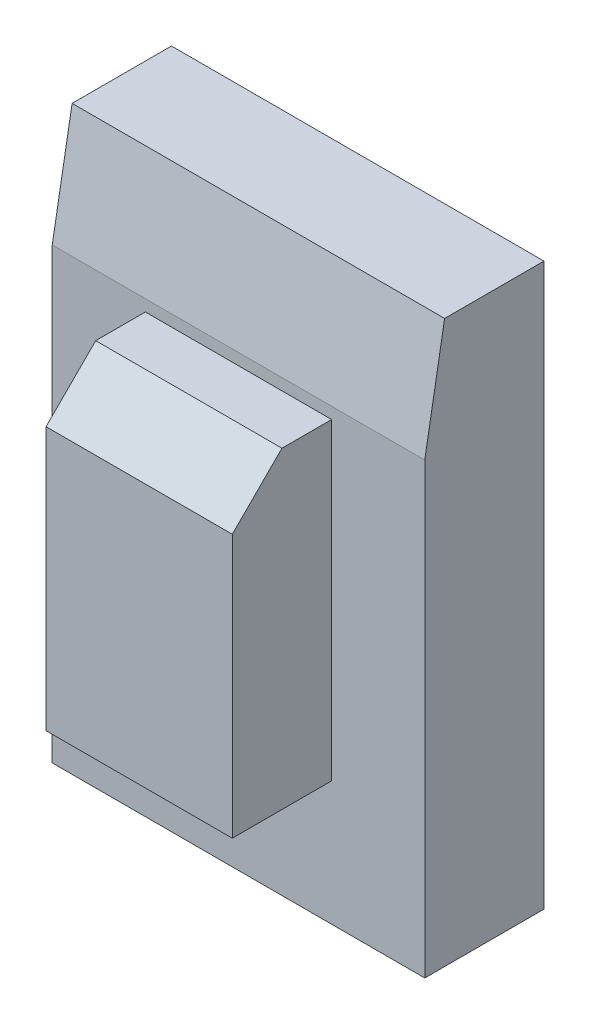
ISO-10303-21;
HEADER;
FILE_DESCRIPTION(('STEP AP214'),'2;1');
FILE_NAME('part.step','',(''),(''),'','','');
FILE_SCHEMA(('AUTOMOTIVE_DESIGN { 1 0 10303 214 1 1 1 1 }'));
ENDSEC;
DATA;
#1=APPLICATION_CONTEXT('core data for automotive mechanical design processes');
#2=APPLICATION_PROTOCOL_DEFINITION('international standard','automotive_design',2000,#1);
#3=PRODUCT_CONTEXT('',#1,'mechanical');
#4=PRODUCT('Part','Part','',(#3));
#5=PRODUCT_RELATED_PRODUCT_CATEGORY('part','',(#4));
#6=PRODUCT_DEFINITION_FORMATION('','',#4);
#7=PRODUCT_DEFINITION_CONTEXT('part definition',#1,'design');
#8=PRODUCT_DEFINITION('design','',#6,#7);
#9=PRODUCT_DEFINITION_SHAPE('','',#8);
#10=(LENGTH_UNIT() NAMED_UNIT(*) SI_UNIT(.MILLI.,.METRE.));
#11=(NAMED_UNIT(*) PLANE_ANGLE_UNIT() SI_UNIT($,.RADIAN.));
#12=(NAMED_UNIT(*) SI_UNIT($,.STERADIAN.) SOLID_ANGLE_UNIT());
#13=UNCERTAINTY_MEASURE_WITH_UNIT(LENGTH_MEASURE(1.E-05),#10,'distance_accuracy_value','');
#14=(GEOMETRIC_REPRESENTATION_CONTEXT(3) GLOBAL_UNCERTAINTY_ASSIGNED_CONTEXT((#13)) GLOBAL_UNIT_ASSIGNED_CONTEXT((#10,
#11,#12)) REPRESENTATION_CONTEXT('',''));
#15=CARTESIAN_POINT('',(0.,0.,0.));
#16=DIRECTION('',(0.,0.,1.));
#17=DIRECTION('',(1.,0.,0.));
#18=AXIS2_PLACEMENT_3D('',#15,#16,#17);
#19=CARTESIAN_POINT('',(0.,0.,3.048));
#20=DIRECTION('',(1.,0.,0.));
#21=DIRECTION('',(0.,0.,-1.));
#22=AXIS2_PLACEMENT_3D('',#19,#20,#21);
#23=PLANE('',#22);
#24=DIRECTION('',(0.,-1.,0.));
#25=VECTOR('',#24,1.);
#26=CARTESIAN_POINT('',(0.,0.,3.048));
#27=LINE('',#26,#25);
#28=CARTESIAN_POINT('',(0.,-2.8810111643658,3.048));
#29=VERTEX_POINT('',#28);
#30=CARTESIAN_POINT('',(0.,-14.351,3.048));
#31=VERTEX_POINT('',#30);
#32=EDGE_CURVE('E157',#29,#31,#27,.T.);
#33=ORIENTED_EDGE('',*,*,#32,.F.);
#34=DIRECTION('',(0.,0.984807753012208,-0.173648177666931));
#35=VECTOR('',#34,1.);
#36=CARTESIAN_POINT('',(0.,-2.8810111643658,3.048));
#37=LINE('',#36,#35);
#38=CARTESIAN_POINT('',(0.,0.,2.54));
#39=VERTEX_POINT('',#38);
#40=EDGE_CURVE('E61',#29,#39,#37,.T.);
#41=ORIENTED_EDGE('',*,*,#40,.T.);
#42=DIRECTION('',(0.,0.,-1.));
#43=VECTOR('',#42,1.);
#44=CARTESIAN_POINT('',(0.,0.,3.048));
#45=LINE('',#44,#43);
#46=CARTESIAN_POINT('',(0.,0.,0.));
#47=VERTEX_POINT('',#46);
#48=EDGE_CURVE('E165',#39,#47,#45,.T.);
#49=ORIENTED_EDGE('',*,*,#48,.T.);
#50=DIRECTION('',(0.,-1.,0.));
#51=VECTOR('',#50,1.);
#52=CARTESIAN_POINT('',(0.,0.,0.));
#53=LINE('',#52,#51);
#54=CARTESIAN_POINT('',(0.,-14.351,0.));
#55=VERTEX_POINT('',#54);
#56=EDGE_CURVE('E156',#47,#55,#53,.T.);
#57=ORIENTED_EDGE('',*,*,#56,.T.);
#58=DIRECTION('',(0.,0.,-1.));
#59=VECTOR('',#58,1.);
#60=CARTESIAN_POINT('',(0.,-14.351,3.048));
#61=LINE('',#60,#59);
#62=EDGE_CURVE('E181',#31,#55,#61,.T.);
#63=ORIENTED_EDGE('',*,*,#62,.F.);
#64=EDGE_LOOP('',(#33,#41,#49,#57,#63));
#65=FACE_BOUND('',#64,.T.);
#66=ADVANCED_FACE('F38',(#65),#23,.F.);
#67=CARTESIAN_POINT('',(0.,-14.351,3.048));
#68=DIRECTION('',(0.,1.,0.));
#69=DIRECTION('',(0.,0.,1.));
#70=AXIS2_PLACEMENT_3D('',#67,#68,#69);
#71=PLANE('',#70);
#72=DIRECTION('',(1.,0.,0.));
#73=VECTOR('',#72,1.);
#74=CARTESIAN_POINT('',(0.,-14.351,0.));
#75=LINE('',#74,#73);
#76=CARTESIAN_POINT('',(9.525,-14.351,0.));
#77=VERTEX_POINT('',#76);
#78=EDGE_CURVE('E168',#55,#77,#75,.T.);
#79=ORIENTED_EDGE('',*,*,#78,.T.);
#80=DIRECTION('',(0.,0.,-1.));
#81=VECTOR('',#80,1.);
#82=CARTESIAN_POINT('',(9.525,-14.351,3.048));
#83=LINE('',#82,#81);
#84=CARTESIAN_POINT('',(9.525,-14.351,3.048));
#85=VERTEX_POINT('',#84);
#86=EDGE_CURVE('E178',#85,#77,#83,.T.);
#87=ORIENTED_EDGE('',*,*,#86,.F.);
#88=DIRECTION('',(1.,0.,0.));
#89=VECTOR('',#88,1.);
#90=CARTESIAN_POINT('',(0.,-14.351,3.048));
#91=LINE('',#90,#89);
#92=EDGE_CURVE('E159',#31,#85,#91,.T.);
#93=ORIENTED_EDGE('',*,*,#92,.F.);
#94=ORIENTED_EDGE('',*,*,#62,.T.);
#95=EDGE_LOOP('',(#79,#87,#93,#94));
#96=FACE_BOUND('',#95,.T.);
#97=ADVANCED_FACE('F204',(#96),#71,.F.);
#98=CARTESIAN_POINT('',(9.525,0.,3.048));
#99=DIRECTION('',(-1.,0.,0.));
#100=DIRECTION('',(0.,-1.,0.));
#101=AXIS2_PLACEMENT_3D('',#98,#99,#100);
#102=PLANE('',#101);
#103=DIRECTION('',(0.,0.,-1.));
#104=VECTOR('',#103,1.);
#105=CARTESIAN_POINT('',(9.525,0.,3.048));
#106=LINE('',#105,#104);
#107=CARTESIAN_POINT('',(9.525,0.,2.54));
#108=VERTEX_POINT('',#107);
#109=CARTESIAN_POINT('',(9.525,0.,0.));
#110=VERTEX_POINT('',#109);
#111=EDGE_CURVE('E176',#108,#110,#106,.T.);
#112=ORIENTED_EDGE('',*,*,#111,.F.);
#113=DIRECTION('',(0.,-0.984807753012208,0.173648177666931));
#114=VECTOR('',#113,1.);
#115=CARTESIAN_POINT('',(9.525,-2.8810111643658,3.048));
#116=LINE('',#115,#114);
#117=CARTESIAN_POINT('',(9.525,-2.8810111643658,3.048));
#118=VERTEX_POINT('',#117);
#119=EDGE_CURVE('E11',#108,#118,#116,.T.);
#120=ORIENTED_EDGE('',*,*,#119,.T.);
#121=DIRECTION('',(0.,1.,0.));
#122=VECTOR('',#121,1.);
#123=CARTESIAN_POINT('',(9.525,0.,3.048));
#124=LINE('',#123,#122);
#125=EDGE_CURVE('E162',#85,#118,#124,.T.);
#126=ORIENTED_EDGE('',*,*,#125,.F.);
#127=ORIENTED_EDGE('',*,*,#86,.T.);
#128=DIRECTION('',(0.,1.,0.));
#129=VECTOR('',#128,1.);
#130=CARTESIAN_POINT('',(9.525,0.,0.));
#131=LINE('',#130,#129);
#132=EDGE_CURVE('E170',#77,#110,#131,.T.);
#133=ORIENTED_EDGE('',*,*,#132,.T.);
#134=EDGE_LOOP('',(#112,#120,#126,#127,#133));
#135=FACE_BOUND('',#134,.T.);
#136=ADVANCED_FACE('F208',(#135),#102,.F.);
#137=CARTESIAN_POINT('',(0.,0.,3.048));
#138=DIRECTION('',(0.,-1.,0.));
#139=DIRECTION('',(0.,0.,-1.));
#140=AXIS2_PLACEMENT_3D('',#137,#138,#139);
#141=PLANE('',#140);
#142=ORIENTED_EDGE('',*,*,#48,.F.);
#143=DIRECTION('',(1.,0.,0.));
#144=VECTOR('',#143,1.);
#145=CARTESIAN_POINT('',(9.525,0.,2.54));
#146=LINE('',#145,#144);
#147=EDGE_CURVE('E47',#39,#108,#146,.T.);
#148=ORIENTED_EDGE('',*,*,#147,.T.);
#149=ORIENTED_EDGE('',*,*,#111,.T.);
#150=DIRECTION('',(-1.,0.,0.));
#151=VECTOR('',#150,1.);
#152=CARTESIAN_POINT('',(0.,0.,0.));
#153=LINE('',#152,#151);
#154=EDGE_CURVE('E160',#110,#47,#153,.T.);
#155=ORIENTED_EDGE('',*,*,#154,.T.);
#156=EDGE_LOOP('',(#142,#148,#149,#155));
#157=FACE_BOUND('',#156,.T.);
#158=ADVANCED_FACE('F229',(#157),#141,.F.);
#159=CARTESIAN_POINT('',(0.,0.,3.048));
#160=DIRECTION('',(0.,0.,1.));
#161=DIRECTION('',(1.,0.,0.));
#162=AXIS2_PLACEMENT_3D('',#159,#160,#161);
#163=PLANE('',#162);
#164=DIRECTION('',(0.,1.,0.));
#165=VECTOR('',#164,1.);
#166=CARTESIAN_POINT('',(7.14375,-11.176,3.048));
#167=LINE('',#166,#165);
#168=CARTESIAN_POINT('',(7.14375,-11.176,3.048));
#169=VERTEX_POINT('',#168);
#170=CARTESIAN_POINT('',(7.14375,-3.175,3.048));
#171=VERTEX_POINT('',#170);
#172=EDGE_CURVE('E144',#169,#171,#167,.T.);
#173=ORIENTED_EDGE('',*,*,#172,.F.);
#174=DIRECTION('',(1.,0.,0.));
#175=VECTOR('',#174,1.);
#176=CARTESIAN_POINT('',(2.38125,-11.176,3.048));
#177=LINE('',#176,#175);
#178=CARTESIAN_POINT('',(2.38125,-11.176,3.048));
#179=VERTEX_POINT('',#178);
#180=EDGE_CURVE('E151',#179,#169,#177,.T.);
#181=ORIENTED_EDGE('',*,*,#180,.F.);
#182=DIRECTION('',(0.,-1.,0.));
#183=VECTOR('',#182,1.);
#184=CARTESIAN_POINT('',(2.38125,-3.175,3.048));
#185=LINE('',#184,#183);
#186=CARTESIAN_POINT('',(2.38125,-3.175,3.048));
#187=VERTEX_POINT('',#186);
#188=EDGE_CURVE('E131',#187,#179,#185,.T.);
#189=ORIENTED_EDGE('',*,*,#188,.F.);
#190=DIRECTION('',(-1.,0.,0.));
#191=VECTOR('',#190,1.);
#192=CARTESIAN_POINT('',(2.38125,-3.175,3.048));
#193=LINE('',#192,#191);
#194=EDGE_CURVE('E147',#171,#187,#193,.T.);
#195=ORIENTED_EDGE('',*,*,#194,.F.);
#196=EDGE_LOOP('',(#173,#181,#189,#195));
#197=FACE_BOUND('',#196,.T.);
#198=ORIENTED_EDGE('',*,*,#125,.T.);
#199=DIRECTION('',(-1.,0.,0.));
#200=VECTOR('',#199,1.);
#201=CARTESIAN_POINT('',(0.,-2.8810111643658,3.048));
#202=LINE('',#201,#200);
#203=EDGE_CURVE('E191',#118,#29,#202,.T.);
#204=ORIENTED_EDGE('',*,*,#203,.T.);
#205=ORIENTED_EDGE('',*,*,#32,.T.);
#206=ORIENTED_EDGE('',*,*,#92,.T.);
#207=EDGE_LOOP('',(#198,#204,#205,#206));
#208=FACE_BOUND('',#207,.T.);
#209=ADVANCED_FACE('F196',(#197,#208),#163,.T.);
#210=CARTESIAN_POINT('',(0.,0.,0.));
#211=DIRECTION('',(0.,0.,1.));
#212=DIRECTION('',(1.,0.,0.));
#213=AXIS2_PLACEMENT_3D('',#210,#211,#212);
#214=PLANE('',#213);
#215=ORIENTED_EDGE('',*,*,#56,.F.);
#216=ORIENTED_EDGE('',*,*,#154,.F.);
#217=ORIENTED_EDGE('',*,*,#132,.F.);
#218=ORIENTED_EDGE('',*,*,#78,.F.);
#219=EDGE_LOOP('',(#215,#216,#217,#218));
#220=FACE_BOUND('',#219,.T.);
#221=ADVANCED_FACE('F232',(#220),#214,.F.);
#222=CARTESIAN_POINT('',(7.14375,-11.176,5.588));
#223=DIRECTION('',(-1.,0.,0.));
#224=DIRECTION('',(0.,0.,1.));
#225=AXIS2_PLACEMENT_3D('',#222,#223,#224);
#226=PLANE('',#225);
#227=DIRECTION('',(0.,0.,-1.));
#228=VECTOR('',#227,1.);
#229=CARTESIAN_POINT('',(7.14375,-3.175,5.588));
#230=LINE('',#229,#228);
#231=CARTESIAN_POINT('',(7.14375,-3.175,4.31799999999999));
#232=VERTEX_POINT('',#231);
#233=EDGE_CURVE('E154',#232,#171,#230,.T.);
#234=ORIENTED_EDGE('',*,*,#233,.F.);
#235=DIRECTION('',(0.,0.707106781186546,-0.707106781186549));
#236=VECTOR('',#235,1.);
#237=CARTESIAN_POINT('',(7.14375,-4.445,5.588));
#238=LINE('',#237,#236);
#239=CARTESIAN_POINT('',(7.14375,-4.445,5.588));
#240=VERTEX_POINT('',#239);
#241=EDGE_CURVE('E189',#232,#240,#238,.F.);
#242=ORIENTED_EDGE('',*,*,#241,.T.);
#243=DIRECTION('',(0.,1.,0.));
#244=VECTOR('',#243,1.);
#245=CARTESIAN_POINT('',(7.14375,-11.176,5.588));
#246=LINE('',#245,#244);
#247=CARTESIAN_POINT('',(7.14375,-11.176,5.588));
#248=VERTEX_POINT('',#247);
#249=EDGE_CURVE('E124',#248,#240,#246,.T.);
#250=ORIENTED_EDGE('',*,*,#249,.F.);
#251=DIRECTION('',(0.,0.,-1.));
#252=VECTOR('',#251,1.);
#253=CARTESIAN_POINT('',(7.14375,-11.176,5.588));
#254=LINE('',#253,#252);
#255=EDGE_CURVE('E135',#248,#169,#254,.T.);
#256=ORIENTED_EDGE('',*,*,#255,.T.);
#257=ORIENTED_EDGE('',*,*,#172,.T.);
#258=EDGE_LOOP('',(#234,#242,#250,#256,#257));
#259=FACE_BOUND('',#258,.T.);
#260=ADVANCED_FACE('F235',(#259),#226,.F.);
#261=CARTESIAN_POINT('',(2.38125,-3.175,5.588));
#262=DIRECTION('',(0.,-1.,0.));
#263=DIRECTION('',(0.,0.,-1.));
#264=AXIS2_PLACEMENT_3D('',#261,#262,#263);
#265=PLANE('',#264);
#266=DIRECTION('',(0.,0.,-1.));
#267=VECTOR('',#266,1.);
#268=CARTESIAN_POINT('',(2.38125,-3.175,5.588));
#269=LINE('',#268,#267);
#270=CARTESIAN_POINT('',(2.38125,-3.175,4.31799999999999));
#271=VERTEX_POINT('',#270);
#272=EDGE_CURVE('E134',#271,#187,#269,.T.);
#273=ORIENTED_EDGE('',*,*,#272,.F.);
#274=DIRECTION('',(1.,0.,0.));
#275=VECTOR('',#274,1.);
#276=CARTESIAN_POINT('',(2.38125,-3.175,4.31799999999999));
#277=LINE('',#276,#275);
#278=EDGE_CURVE('E187',#271,#232,#277,.T.);
#279=ORIENTED_EDGE('',*,*,#278,.T.);
#280=ORIENTED_EDGE('',*,*,#233,.T.);
#281=ORIENTED_EDGE('',*,*,#194,.T.);
#282=EDGE_LOOP('',(#273,#279,#280,#281));
#283=FACE_BOUND('',#282,.T.);
#284=ADVANCED_FACE('F242',(#283),#265,.F.);
#285=CARTESIAN_POINT('',(2.38125,-3.175,5.588));
#286=DIRECTION('',(1.,0.,0.));
#287=DIRECTION('',(0.,1.,0.));
#288=AXIS2_PLACEMENT_3D('',#285,#286,#287);
#289=PLANE('',#288);
#290=DIRECTION('',(0.,-1.,0.));
#291=VECTOR('',#290,1.);
#292=CARTESIAN_POINT('',(2.38125,-3.175,5.588));
#293=LINE('',#292,#291);
#294=CARTESIAN_POINT('',(2.38125,-4.445,5.588));
#295=VERTEX_POINT('',#294);
#296=CARTESIAN_POINT('',(2.38125,-11.176,5.588));
#297=VERTEX_POINT('',#296);
#298=EDGE_CURVE('E114',#295,#297,#293,.T.);
#299=ORIENTED_EDGE('',*,*,#298,.F.);
#300=DIRECTION('',(0.,-0.707106781186546,0.707106781186549));
#301=VECTOR('',#300,1.);
#302=CARTESIAN_POINT('',(2.38125,-4.445,5.588));
#303=LINE('',#302,#301);
#304=EDGE_CURVE('E185',#295,#271,#303,.F.);
#305=ORIENTED_EDGE('',*,*,#304,.T.);
#306=ORIENTED_EDGE('',*,*,#272,.T.);
#307=ORIENTED_EDGE('',*,*,#188,.T.);
#308=DIRECTION('',(0.,0.,-1.));
#309=VECTOR('',#308,1.);
#310=CARTESIAN_POINT('',(2.38125,-11.176,5.588));
#311=LINE('',#310,#309);
#312=EDGE_CURVE('E128',#297,#179,#311,.T.);
#313=ORIENTED_EDGE('',*,*,#312,.F.);
#314=EDGE_LOOP('',(#299,#305,#306,#307,#313));
#315=FACE_BOUND('',#314,.T.);
#316=ADVANCED_FACE('F129',(#315),#289,.F.);
#317=CARTESIAN_POINT('',(2.38125,-11.176,5.588));
#318=DIRECTION('',(0.,1.,0.));
#319=DIRECTION('',(0.,0.,1.));
#320=AXIS2_PLACEMENT_3D('',#317,#318,#319);
#321=PLANE('',#320);
#322=ORIENTED_EDGE('',*,*,#180,.T.);
#323=ORIENTED_EDGE('',*,*,#255,.F.);
#324=DIRECTION('',(1.,0.,0.));
#325=VECTOR('',#324,1.);
#326=CARTESIAN_POINT('',(2.38125,-11.176,5.588));
#327=LINE('',#326,#325);
#328=EDGE_CURVE('E119',#297,#248,#327,.T.);
#329=ORIENTED_EDGE('',*,*,#328,.F.);
#330=ORIENTED_EDGE('',*,*,#312,.T.);
#331=EDGE_LOOP('',(#322,#323,#329,#330));
#332=FACE_BOUND('',#331,.T.);
#333=ADVANCED_FACE('F137',(#332),#321,.F.);
#334=CARTESIAN_POINT('',(0.,0.,5.588));
#335=DIRECTION('',(0.,0.,-1.));
#336=DIRECTION('',(-1.,0.,0.));
#337=AXIS2_PLACEMENT_3D('',#334,#335,#336);
#338=PLANE('',#337);
#339=ORIENTED_EDGE('',*,*,#249,.T.);
#340=DIRECTION('',(-1.,0.,0.));
#341=VECTOR('',#340,1.);
#342=CARTESIAN_POINT('',(0.,-4.445,5.588));
#343=LINE('',#342,#341);
#344=EDGE_CURVE('E122',#240,#295,#343,.T.);
#345=ORIENTED_EDGE('',*,*,#344,.T.);
#346=ORIENTED_EDGE('',*,*,#298,.T.);
#347=ORIENTED_EDGE('',*,*,#328,.T.);
#348=EDGE_LOOP('',(#339,#345,#346,#347));
#349=FACE_BOUND('',#348,.T.);
#350=ADVANCED_FACE('F117',(#349),#338,.F.);
#351=CARTESIAN_POINT('',(0.,-4.445,5.588));
#352=DIRECTION('',(0.,-0.707106781186549,-0.707106781186546));
#353=DIRECTION('',(-1.,0.,0.));
#354=AXIS2_PLACEMENT_3D('',#351,#352,#353);
#355=PLANE('',#354);
#356=ORIENTED_EDGE('',*,*,#241,.F.);
#357=ORIENTED_EDGE('',*,*,#278,.F.);
#358=ORIENTED_EDGE('',*,*,#304,.F.);
#359=ORIENTED_EDGE('',*,*,#344,.F.);
#360=EDGE_LOOP('',(#356,#357,#358,#359));
#361=FACE_BOUND('',#360,.T.);
#362=ADVANCED_FACE('F210',(#361),#355,.F.);
#363=CARTESIAN_POINT('',(0.,-2.8810111643658,3.048));
#364=DIRECTION('',(0.,0.173648177666931,0.984807753012208));
#365=DIRECTION('',(1.,0.,0.));
#366=AXIS2_PLACEMENT_3D('',#363,#364,#365);
#367=PLANE('',#366);
#368=ORIENTED_EDGE('',*,*,#119,.F.);
#369=ORIENTED_EDGE('',*,*,#147,.F.);
#370=ORIENTED_EDGE('',*,*,#40,.F.);
#371=ORIENTED_EDGE('',*,*,#203,.F.);
#372=EDGE_LOOP('',(#368,#369,#370,#371));
#373=FACE_BOUND('',#372,.T.);
#374=ADVANCED_FACE('F41',(#373),#367,.T.);
#375=CLOSED_SHELL('',(#66,#97,#136,#158,#209,#221,#260,#284,#316,#333,#350,#362,#374));
#376=MANIFOLD_SOLID_BREP('B2',#375);
#377=ADVANCED_BREP_SHAPE_REPRESENTATION('',(#18,#376),#14);
#378=SHAPE_DEFINITION_REPRESENTATION(#9,#377);
ENDSEC;
END-ISO-10303-21;
